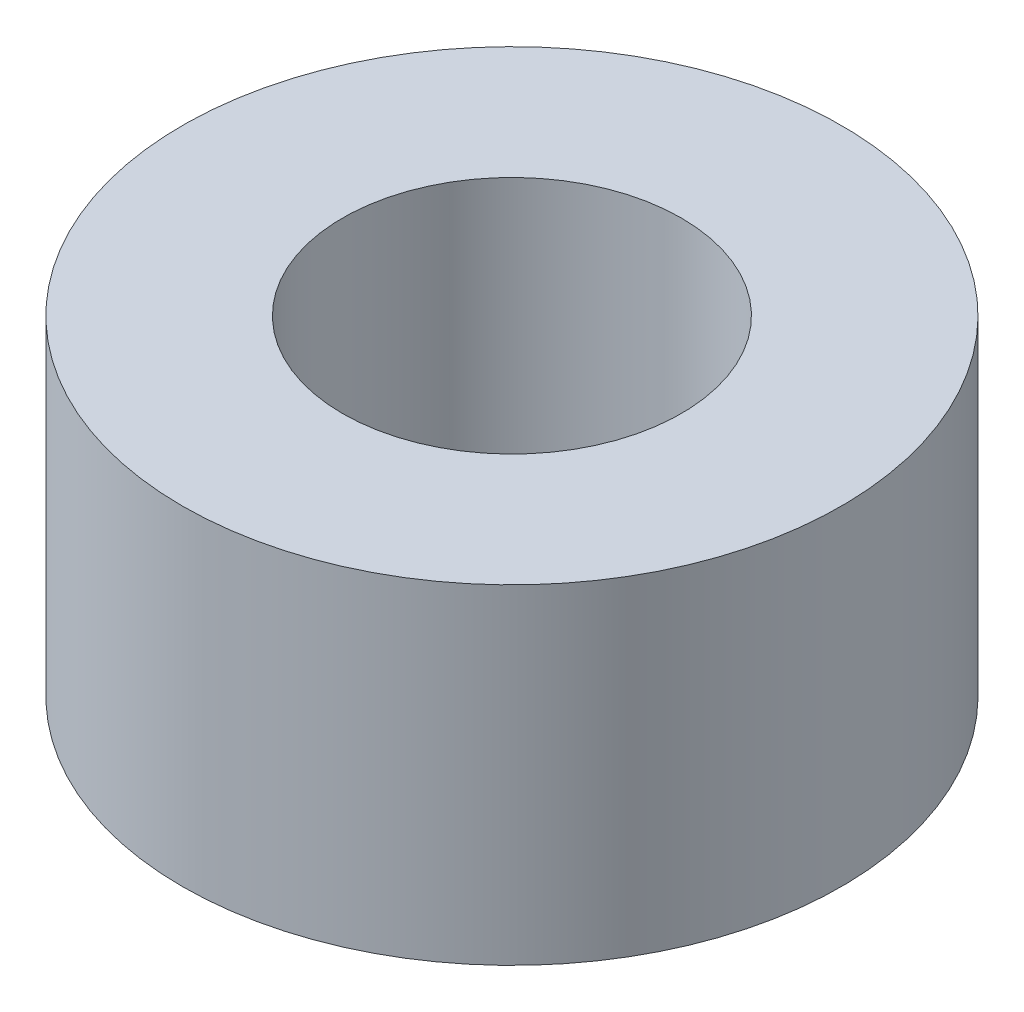
ISO-10303-21;
HEADER;
FILE_DESCRIPTION(('STEP AP214'),'2;1');
FILE_NAME('part.step','',(''),(''),'','','');
FILE_SCHEMA(('AUTOMOTIVE_DESIGN { 1 0 10303 214 1 1 1 1 }'));
ENDSEC;
DATA;
#1=APPLICATION_CONTEXT('core data for automotive mechanical design processes');
#2=APPLICATION_PROTOCOL_DEFINITION('international standard','automotive_design',2000,#1);
#3=PRODUCT_CONTEXT('',#1,'mechanical');
#4=PRODUCT('Part','Part','',(#3));
#5=PRODUCT_RELATED_PRODUCT_CATEGORY('part','',(#4));
#6=PRODUCT_DEFINITION_FORMATION('','',#4);
#7=PRODUCT_DEFINITION_CONTEXT('part definition',#1,'design');
#8=PRODUCT_DEFINITION('design','',#6,#7);
#9=PRODUCT_DEFINITION_SHAPE('','',#8);
#10=(LENGTH_UNIT() NAMED_UNIT(*) SI_UNIT(.MILLI.,.METRE.));
#11=(NAMED_UNIT(*) PLANE_ANGLE_UNIT() SI_UNIT($,.RADIAN.));
#12=(NAMED_UNIT(*) SI_UNIT($,.STERADIAN.) SOLID_ANGLE_UNIT());
#13=UNCERTAINTY_MEASURE_WITH_UNIT(LENGTH_MEASURE(1.E-05),#10,'distance_accuracy_value','');
#14=(GEOMETRIC_REPRESENTATION_CONTEXT(3) GLOBAL_UNCERTAINTY_ASSIGNED_CONTEXT((#13)) GLOBAL_UNIT_ASSIGNED_CONTEXT((#10,
#11,#12)) REPRESENTATION_CONTEXT('',''));
#15=CARTESIAN_POINT('',(0.,0.,0.));
#16=DIRECTION('',(0.,0.,1.));
#17=DIRECTION('',(1.,0.,0.));
#18=AXIS2_PLACEMENT_3D('',#15,#16,#17);
#19=CARTESIAN_POINT('',(0.,6.35,0.));
#20=DIRECTION('',(0.,1.,0.));
#21=DIRECTION('',(0.,0.,1.));
#22=AXIS2_PLACEMENT_3D('',#19,#20,#21);
#23=PLANE('',#22);
#24=CARTESIAN_POINT('',(0.,6.35,0.));
#25=DIRECTION('',(0.,1.,0.));
#26=DIRECTION('',(0.,0.,1.));
#27=AXIS2_PLACEMENT_3D('',#24,#25,#26);
#28=CIRCLE('',#27,6.35);
#29=CARTESIAN_POINT('',(0.,6.35,6.35));
#30=VERTEX_POINT('',#29);
#31=EDGE_CURVE('E10',#30,#30,#28,.T.);
#32=ORIENTED_EDGE('',*,*,#31,.T.);
#33=EDGE_LOOP('',(#32));
#34=FACE_BOUND('',#33,.T.);
#35=CARTESIAN_POINT('',(0.,6.35,0.));
#36=DIRECTION('',(0.,1.,0.));
#37=DIRECTION('',(0.,0.,1.));
#38=AXIS2_PLACEMENT_3D('',#35,#36,#37);
#39=CIRCLE('',#38,3.2639);
#40=CARTESIAN_POINT('',(0.,6.35,3.2639));
#41=VERTEX_POINT('',#40);
#42=EDGE_CURVE('E50',#41,#41,#39,.T.);
#43=ORIENTED_EDGE('',*,*,#42,.F.);
#44=EDGE_LOOP('',(#43));
#45=FACE_BOUND('',#44,.T.);
#46=ADVANCED_FACE('F37',(#34,#45),#23,.T.);
#47=CARTESIAN_POINT('',(0.,0.,0.));
#48=DIRECTION('',(0.,1.,0.));
#49=DIRECTION('',(0.,0.,1.));
#50=AXIS2_PLACEMENT_3D('',#47,#48,#49);
#51=PLANE('',#50);
#52=CARTESIAN_POINT('',(0.,0.,0.));
#53=DIRECTION('',(0.,1.,0.));
#54=DIRECTION('',(0.,0.,1.));
#55=AXIS2_PLACEMENT_3D('',#52,#53,#54);
#56=CIRCLE('',#55,6.35);
#57=CARTESIAN_POINT('',(0.,0.,6.35));
#58=VERTEX_POINT('',#57);
#59=EDGE_CURVE('E41',#58,#58,#56,.T.);
#60=ORIENTED_EDGE('',*,*,#59,.F.);
#61=EDGE_LOOP('',(#60));
#62=FACE_BOUND('',#61,.T.);
#63=CARTESIAN_POINT('',(0.,0.,0.));
#64=DIRECTION('',(0.,1.,0.));
#65=DIRECTION('',(0.,0.,1.));
#66=AXIS2_PLACEMENT_3D('',#63,#64,#65);
#67=CIRCLE('',#66,3.2639);
#68=CARTESIAN_POINT('',(0.,0.,3.2639));
#69=VERTEX_POINT('',#68);
#70=EDGE_CURVE('E52',#69,#69,#67,.T.);
#71=ORIENTED_EDGE('',*,*,#70,.T.);
#72=EDGE_LOOP('',(#71));
#73=FACE_BOUND('',#72,.T.);
#74=ADVANCED_FACE('F64',(#62,#73),#51,.F.);
#75=CARTESIAN_POINT('',(0.,6.35,0.));
#76=DIRECTION('',(0.,-1.,0.));
#77=DIRECTION('',(0.,0.,-1.));
#78=AXIS2_PLACEMENT_3D('',#75,#76,#77);
#79=CYLINDRICAL_SURFACE('',#78,6.35);
#80=ORIENTED_EDGE('',*,*,#31,.F.);
#81=EDGE_LOOP('',(#80));
#82=FACE_BOUND('',#81,.T.);
#83=ORIENTED_EDGE('',*,*,#59,.T.);
#84=EDGE_LOOP('',(#83));
#85=FACE_BOUND('',#84,.T.);
#86=ADVANCED_FACE('F39',(#82,#85),#79,.T.);
#87=CARTESIAN_POINT('',(0.,6.35,0.));
#88=DIRECTION('',(0.,-1.,0.));
#89=DIRECTION('',(0.,0.,-1.));
#90=AXIS2_PLACEMENT_3D('',#87,#88,#89);
#91=CYLINDRICAL_SURFACE('',#90,3.2639);
#92=ORIENTED_EDGE('',*,*,#42,.T.);
#93=EDGE_LOOP('',(#92));
#94=FACE_BOUND('',#93,.T.);
#95=ORIENTED_EDGE('',*,*,#70,.F.);
#96=EDGE_LOOP('',(#95));
#97=FACE_BOUND('',#96,.T.);
#98=ADVANCED_FACE('F60',(#94,#97),#91,.F.);
#99=CLOSED_SHELL('',(#46,#74,#86,#98));
#100=MANIFOLD_SOLID_BREP('B2',#99);
#101=ADVANCED_BREP_SHAPE_REPRESENTATION('',(#18,#100),#14);
#102=SHAPE_DEFINITION_REPRESENTATION(#9,#101);
ENDSEC;
END-ISO-10303-21;
